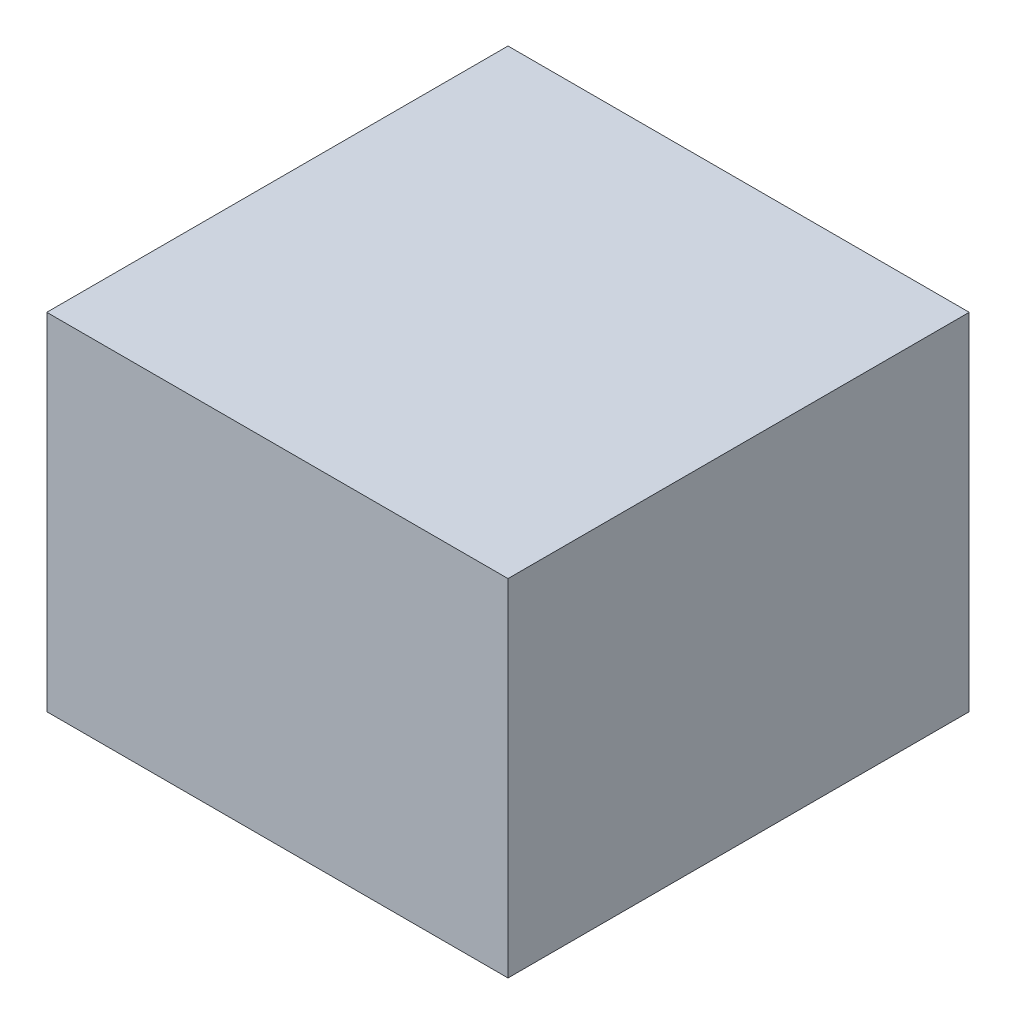
ISO-10303-21;
HEADER;
FILE_DESCRIPTION(('STEP AP214'),'2;1');
FILE_NAME('part.step','',(''),(''),'','','');
FILE_SCHEMA(('AUTOMOTIVE_DESIGN { 1 0 10303 214 1 1 1 1 }'));
ENDSEC;
DATA;
#1=APPLICATION_CONTEXT('core data for automotive mechanical design processes');
#2=APPLICATION_PROTOCOL_DEFINITION('international standard','automotive_design',2000,#1);
#3=PRODUCT_CONTEXT('',#1,'mechanical');
#4=PRODUCT('Part','Part','',(#3));
#5=PRODUCT_RELATED_PRODUCT_CATEGORY('part','',(#4));
#6=PRODUCT_DEFINITION_FORMATION('','',#4);
#7=PRODUCT_DEFINITION_CONTEXT('part definition',#1,'design');
#8=PRODUCT_DEFINITION('design','',#6,#7);
#9=PRODUCT_DEFINITION_SHAPE('','',#8);
#10=(LENGTH_UNIT() NAMED_UNIT(*) SI_UNIT(.MILLI.,.METRE.));
#11=(NAMED_UNIT(*) PLANE_ANGLE_UNIT() SI_UNIT($,.RADIAN.));
#12=(NAMED_UNIT(*) SI_UNIT($,.STERADIAN.) SOLID_ANGLE_UNIT());
#13=UNCERTAINTY_MEASURE_WITH_UNIT(LENGTH_MEASURE(1.E-05),#10,'distance_accuracy_value','');
#14=(GEOMETRIC_REPRESENTATION_CONTEXT(3) GLOBAL_UNCERTAINTY_ASSIGNED_CONTEXT((#13)) GLOBAL_UNIT_ASSIGNED_CONTEXT((#10,
#11,#12)) REPRESENTATION_CONTEXT('',''));
#15=CARTESIAN_POINT('',(0.,0.,0.));
#16=DIRECTION('',(0.,0.,1.));
#17=DIRECTION('',(1.,0.,0.));
#18=AXIS2_PLACEMENT_3D('',#15,#16,#17);
#19=CARTESIAN_POINT('',(420.,862.,-380.));
#20=DIRECTION('',(-1.,0.,0.));
#21=DIRECTION('',(0.,0.,1.));
#22=AXIS2_PLACEMENT_3D('',#19,#20,#21);
#23=PLANE('',#22);
#24=DIRECTION('',(0.,-1.,0.));
#25=VECTOR('',#24,1.);
#26=CARTESIAN_POINT('',(420.,862.,-340.));
#27=LINE('',#26,#25);
#28=CARTESIAN_POINT('',(420.,892.,-340.));
#29=VERTEX_POINT('',#28);
#30=CARTESIAN_POINT('',(420.,862.,-340.));
#31=VERTEX_POINT('',#30);
#32=EDGE_CURVE('E103',#29,#31,#27,.T.);
#33=ORIENTED_EDGE('',*,*,#32,.F.);
#34=DIRECTION('',(0.,0.,1.));
#35=VECTOR('',#34,1.);
#36=CARTESIAN_POINT('',(420.,892.,-380.));
#37=LINE('',#36,#35);
#38=CARTESIAN_POINT('',(420.,892.,-380.));
#39=VERTEX_POINT('',#38);
#40=EDGE_CURVE('E11',#39,#29,#37,.T.);
#41=ORIENTED_EDGE('',*,*,#40,.F.);
#42=DIRECTION('',(0.,-1.,0.));
#43=VECTOR('',#42,1.);
#44=CARTESIAN_POINT('',(420.,862.,-380.));
#45=LINE('',#44,#43);
#46=CARTESIAN_POINT('',(420.,862.,-380.));
#47=VERTEX_POINT('',#46);
#48=EDGE_CURVE('E97',#39,#47,#45,.T.);
#49=ORIENTED_EDGE('',*,*,#48,.T.);
#50=DIRECTION('',(0.,0.,1.));
#51=VECTOR('',#50,1.);
#52=CARTESIAN_POINT('',(420.,862.,-380.));
#53=LINE('',#52,#51);
#54=EDGE_CURVE('E42',#47,#31,#53,.T.);
#55=ORIENTED_EDGE('',*,*,#54,.T.);
#56=EDGE_LOOP('',(#33,#41,#49,#55));
#57=FACE_BOUND('',#56,.T.);
#58=ADVANCED_FACE('F39',(#57),#23,.T.);
#59=CARTESIAN_POINT('',(420.,892.,-380.));
#60=DIRECTION('',(0.,1.,0.));
#61=DIRECTION('',(0.,0.,1.));
#62=AXIS2_PLACEMENT_3D('',#59,#60,#61);
#63=PLANE('',#62);
#64=DIRECTION('',(-1.,0.,0.));
#65=VECTOR('',#64,1.);
#66=CARTESIAN_POINT('',(420.,892.,-340.));
#67=LINE('',#66,#65);
#68=CARTESIAN_POINT('',(460.,892.,-340.));
#69=VERTEX_POINT('',#68);
#70=EDGE_CURVE('E99',#69,#29,#67,.T.);
#71=ORIENTED_EDGE('',*,*,#70,.F.);
#72=DIRECTION('',(0.,0.,1.));
#73=VECTOR('',#72,1.);
#74=CARTESIAN_POINT('',(460.,892.,-380.));
#75=LINE('',#74,#73);
#76=CARTESIAN_POINT('',(460.,892.,-380.));
#77=VERTEX_POINT('',#76);
#78=EDGE_CURVE('E48',#77,#69,#75,.T.);
#79=ORIENTED_EDGE('',*,*,#78,.F.);
#80=DIRECTION('',(-1.,0.,0.));
#81=VECTOR('',#80,1.);
#82=CARTESIAN_POINT('',(420.,892.,-380.));
#83=LINE('',#82,#81);
#84=EDGE_CURVE('E94',#77,#39,#83,.T.);
#85=ORIENTED_EDGE('',*,*,#84,.T.);
#86=ORIENTED_EDGE('',*,*,#40,.T.);
#87=EDGE_LOOP('',(#71,#79,#85,#86));
#88=FACE_BOUND('',#87,.T.);
#89=ADVANCED_FACE('F113',(#88),#63,.T.);
#90=CARTESIAN_POINT('',(460.,862.,-380.));
#91=DIRECTION('',(1.,0.,0.));
#92=DIRECTION('',(0.,0.,-1.));
#93=AXIS2_PLACEMENT_3D('',#90,#91,#92);
#94=PLANE('',#93);
#95=DIRECTION('',(0.,1.,0.));
#96=VECTOR('',#95,1.);
#97=CARTESIAN_POINT('',(460.,862.,-340.));
#98=LINE('',#97,#96);
#99=CARTESIAN_POINT('',(460.,862.,-340.));
#100=VERTEX_POINT('',#99);
#101=EDGE_CURVE('E89',#100,#69,#98,.T.);
#102=ORIENTED_EDGE('',*,*,#101,.F.);
#103=DIRECTION('',(0.,0.,1.));
#104=VECTOR('',#103,1.);
#105=CARTESIAN_POINT('',(460.,862.,-380.));
#106=LINE('',#105,#104);
#107=CARTESIAN_POINT('',(460.,862.,-380.));
#108=VERTEX_POINT('',#107);
#109=EDGE_CURVE('E84',#108,#100,#106,.T.);
#110=ORIENTED_EDGE('',*,*,#109,.F.);
#111=DIRECTION('',(0.,1.,0.));
#112=VECTOR('',#111,1.);
#113=CARTESIAN_POINT('',(460.,862.,-380.));
#114=LINE('',#113,#112);
#115=EDGE_CURVE('E87',#108,#77,#114,.T.);
#116=ORIENTED_EDGE('',*,*,#115,.T.);
#117=ORIENTED_EDGE('',*,*,#78,.T.);
#118=EDGE_LOOP('',(#102,#110,#116,#117));
#119=FACE_BOUND('',#118,.T.);
#120=ADVANCED_FACE('F86',(#119),#94,.T.);
#121=CARTESIAN_POINT('',(420.,862.,-380.));
#122=DIRECTION('',(0.,-1.,0.));
#123=DIRECTION('',(0.,0.,-1.));
#124=AXIS2_PLACEMENT_3D('',#121,#122,#123);
#125=PLANE('',#124);
#126=DIRECTION('',(1.,0.,0.));
#127=VECTOR('',#126,1.);
#128=CARTESIAN_POINT('',(420.,862.,-340.));
#129=LINE('',#128,#127);
#130=EDGE_CURVE('E106',#31,#100,#129,.T.);
#131=ORIENTED_EDGE('',*,*,#130,.F.);
#132=ORIENTED_EDGE('',*,*,#54,.F.);
#133=DIRECTION('',(1.,0.,0.));
#134=VECTOR('',#133,1.);
#135=CARTESIAN_POINT('',(420.,862.,-380.));
#136=LINE('',#135,#134);
#137=EDGE_CURVE('E93',#47,#108,#136,.T.);
#138=ORIENTED_EDGE('',*,*,#137,.T.);
#139=ORIENTED_EDGE('',*,*,#109,.T.);
#140=EDGE_LOOP('',(#131,#132,#138,#139));
#141=FACE_BOUND('',#140,.T.);
#142=ADVANCED_FACE('F96',(#141),#125,.T.);
#143=CARTESIAN_POINT('',(0.,0.,-380.));
#144=DIRECTION('',(0.,0.,-1.));
#145=DIRECTION('',(-1.,0.,0.));
#146=AXIS2_PLACEMENT_3D('',#143,#144,#145);
#147=PLANE('',#146);
#148=ORIENTED_EDGE('',*,*,#48,.F.);
#149=ORIENTED_EDGE('',*,*,#84,.F.);
#150=ORIENTED_EDGE('',*,*,#115,.F.);
#151=ORIENTED_EDGE('',*,*,#137,.F.);
#152=EDGE_LOOP('',(#148,#149,#150,#151));
#153=FACE_BOUND('',#152,.T.);
#154=ADVANCED_FACE('F92',(#153),#147,.T.);
#155=CARTESIAN_POINT('',(0.,0.,-340.));
#156=DIRECTION('',(0.,0.,-1.));
#157=DIRECTION('',(-1.,0.,0.));
#158=AXIS2_PLACEMENT_3D('',#155,#156,#157);
#159=PLANE('',#158);
#160=ORIENTED_EDGE('',*,*,#32,.T.);
#161=ORIENTED_EDGE('',*,*,#130,.T.);
#162=ORIENTED_EDGE('',*,*,#101,.T.);
#163=ORIENTED_EDGE('',*,*,#70,.T.);
#164=EDGE_LOOP('',(#160,#161,#162,#163));
#165=FACE_BOUND('',#164,.T.);
#166=ADVANCED_FACE('F112',(#165),#159,.F.);
#167=CLOSED_SHELL('',(#58,#89,#120,#142,#154,#166));
#168=MANIFOLD_SOLID_BREP('B2',#167);
#169=ADVANCED_BREP_SHAPE_REPRESENTATION('',(#18,#168),#14);
#170=SHAPE_DEFINITION_REPRESENTATION(#9,#169);
ENDSEC;
END-ISO-10303-21;
